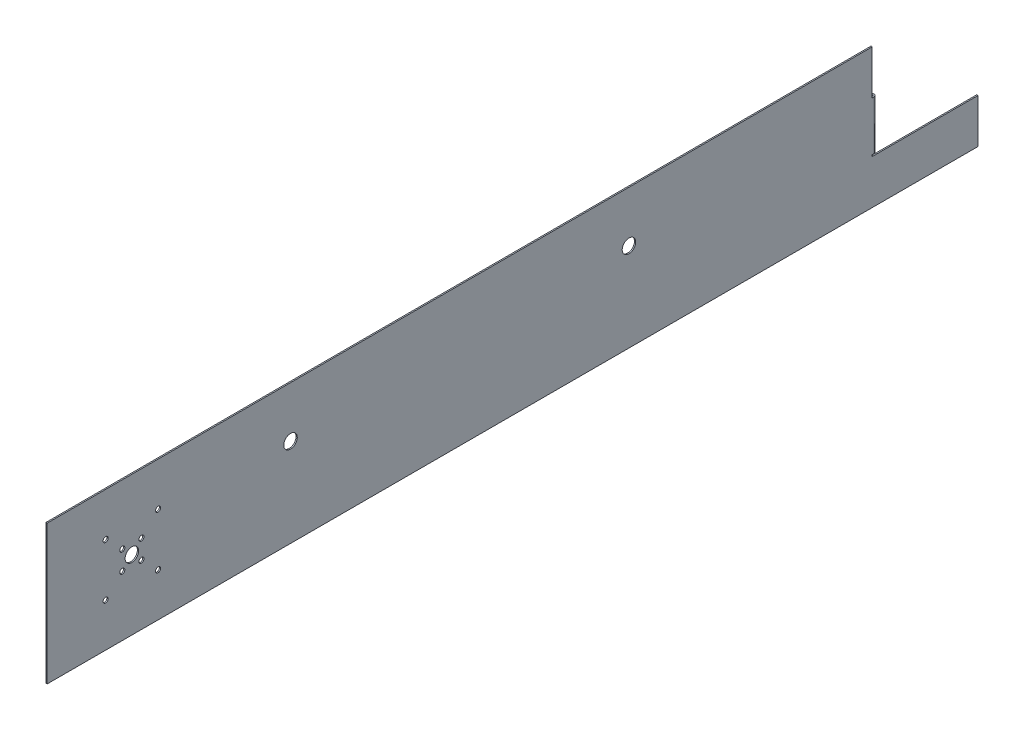
ISO-10303-21;
HEADER;
FILE_DESCRIPTION(('STEP AP214'),'2;1');
FILE_NAME('part.step','',(''),(''),'','','');
FILE_SCHEMA(('AUTOMOTIVE_DESIGN { 1 0 10303 214 1 1 1 1 }'));
ENDSEC;
DATA;
#1=APPLICATION_CONTEXT('core data for automotive mechanical design processes');
#2=APPLICATION_PROTOCOL_DEFINITION('international standard','automotive_design',2000,#1);
#3=PRODUCT_CONTEXT('',#1,'mechanical');
#4=PRODUCT('Part','Part','',(#3));
#5=PRODUCT_RELATED_PRODUCT_CATEGORY('part','',(#4));
#6=PRODUCT_DEFINITION_FORMATION('','',#4);
#7=PRODUCT_DEFINITION_CONTEXT('part definition',#1,'design');
#8=PRODUCT_DEFINITION('design','',#6,#7);
#9=PRODUCT_DEFINITION_SHAPE('','',#8);
#10=(LENGTH_UNIT() NAMED_UNIT(*) SI_UNIT(.MILLI.,.METRE.));
#11=(NAMED_UNIT(*) PLANE_ANGLE_UNIT() SI_UNIT($,.RADIAN.));
#12=(NAMED_UNIT(*) SI_UNIT($,.STERADIAN.) SOLID_ANGLE_UNIT());
#13=UNCERTAINTY_MEASURE_WITH_UNIT(LENGTH_MEASURE(1.E-05),#10,'distance_accuracy_value','');
#14=(GEOMETRIC_REPRESENTATION_CONTEXT(3) GLOBAL_UNCERTAINTY_ASSIGNED_CONTEXT((#13)) GLOBAL_UNIT_ASSIGNED_CONTEXT((#10,
#11,#12)) REPRESENTATION_CONTEXT('',''));
#15=CARTESIAN_POINT('',(0.,0.,0.));
#16=DIRECTION('',(0.,0.,1.));
#17=DIRECTION('',(1.,0.,0.));
#18=AXIS2_PLACEMENT_3D('',#15,#16,#17);
#19=CARTESIAN_POINT('',(60.486673162917,82.3,-60.0124460243925));
#20=DIRECTION('',(1.,0.,0.));
#21=DIRECTION('',(0.,0.,-1.));
#22=AXIS2_PLACEMENT_3D('',#19,#20,#21);
#23=PLANE('',#22);
#24=CARTESIAN_POINT('',(60.4866731629163,52.3,146.237553975608));
#25=DIRECTION('',(1.,0.,0.));
#26=DIRECTION('',(0.,0.,-1.));
#27=AXIS2_PLACEMENT_3D('',#24,#25,#26);
#28=CIRCLE('',#27,3.99999999999999);
#29=CARTESIAN_POINT('',(60.4866731629163,52.3,142.237553975608));
#30=VERTEX_POINT('',#29);
#31=EDGE_CURVE('E449',#30,#30,#28,.T.);
#32=ORIENTED_EDGE('',*,*,#31,.T.);
#33=EDGE_LOOP('',(#32));
#34=FACE_BOUND('',#33,.T.);
#35=CARTESIAN_POINT('',(60.4866731629156,52.3,346.237553975608));
#36=DIRECTION('',(1.,0.,0.));
#37=DIRECTION('',(0.,0.,-1.));
#38=AXIS2_PLACEMENT_3D('',#35,#36,#37);
#39=CIRCLE('',#38,3.99999999999999);
#40=CARTESIAN_POINT('',(60.4866731629156,52.3,342.237553975608));
#41=VERTEX_POINT('',#40);
#42=EDGE_CURVE('E440',#41,#41,#39,.T.);
#43=ORIENTED_EDGE('',*,*,#42,.T.);
#44=EDGE_LOOP('',(#43));
#45=FACE_BOUND('',#44,.T.);
#46=CARTESIAN_POINT('',(60.4866731629153,35.4931457505076,434.330699726115));
#47=DIRECTION('',(-1.,0.,0.));
#48=DIRECTION('',(0.,0.,1.));
#49=AXIS2_PLACEMENT_3D('',#46,#47,#48);
#50=CIRCLE('',#49,1.50000000000002);
#51=CARTESIAN_POINT('',(60.4866731629153,35.4931457505076,435.830699726115));
#52=VERTEX_POINT('',#51);
#53=EDGE_CURVE('E434',#52,#52,#50,.T.);
#54=ORIENTED_EDGE('',*,*,#53,.F.);
#55=EDGE_LOOP('',(#54));
#56=FACE_BOUND('',#55,.T.);
#57=CARTESIAN_POINT('',(60.4866731629153,35.4931457505076,445.6444082251));
#58=DIRECTION('',(-1.,0.,0.));
#59=DIRECTION('',(0.,0.,1.));
#60=AXIS2_PLACEMENT_3D('',#57,#58,#59);
#61=CIRCLE('',#60,1.50000000000002);
#62=CARTESIAN_POINT('',(60.4866731629153,35.4931457505076,447.1444082251));
#63=VERTEX_POINT('',#62);
#64=EDGE_CURVE('E428',#63,#63,#61,.T.);
#65=ORIENTED_EDGE('',*,*,#64,.F.);
#66=EDGE_LOOP('',(#65));
#67=FACE_BOUND('',#66,.T.);
#68=CARTESIAN_POINT('',(60.4866731629153,41.15,439.987553975607));
#69=DIRECTION('',(-1.,0.,0.));
#70=DIRECTION('',(0.,0.,1.));
#71=AXIS2_PLACEMENT_3D('',#68,#69,#70);
#72=CIRCLE('',#71,3.99999999999999);
#73=CARTESIAN_POINT('',(60.4866731629153,41.15,443.987553975607));
#74=VERTEX_POINT('',#73);
#75=EDGE_CURVE('E422',#74,#74,#72,.T.);
#76=ORIENTED_EDGE('',*,*,#75,.F.);
#77=EDGE_LOOP('',(#76));
#78=FACE_BOUND('',#77,.T.);
#79=CARTESIAN_POINT('',(60.4866731629153,46.8068542494924,434.330699726115));
#80=DIRECTION('',(-1.,0.,0.));
#81=DIRECTION('',(0.,0.,1.));
#82=AXIS2_PLACEMENT_3D('',#79,#80,#81);
#83=CIRCLE('',#82,1.50000000000002);
#84=CARTESIAN_POINT('',(60.4866731629153,46.8068542494924,435.830699726115));
#85=VERTEX_POINT('',#84);
#86=EDGE_CURVE('E417',#85,#85,#83,.T.);
#87=ORIENTED_EDGE('',*,*,#86,.F.);
#88=EDGE_LOOP('',(#87));
#89=FACE_BOUND('',#88,.T.);
#90=CARTESIAN_POINT('',(60.4866731629153,46.8068542494924,445.6444082251));
#91=DIRECTION('',(-1.,0.,0.));
#92=DIRECTION('',(0.,0.,1.));
#93=AXIS2_PLACEMENT_3D('',#90,#91,#92);
#94=CIRCLE('',#93,1.50000000000002);
#95=CARTESIAN_POINT('',(60.4866731629153,46.8068542494924,447.1444082251));
#96=VERTEX_POINT('',#95);
#97=EDGE_CURVE('E412',#96,#96,#94,.T.);
#98=ORIENTED_EDGE('',*,*,#97,.F.);
#99=EDGE_LOOP('',(#98));
#100=FACE_BOUND('',#99,.T.);
#101=CARTESIAN_POINT('',(60.4866731629152,56.65,455.487553975607));
#102=DIRECTION('',(-1.,0.,0.));
#103=DIRECTION('',(0.,0.,1.));
#104=AXIS2_PLACEMENT_3D('',#101,#102,#103);
#105=CIRCLE('',#104,1.50000000000008);
#106=CARTESIAN_POINT('',(60.4866731629152,56.65,456.987553975608));
#107=VERTEX_POINT('',#106);
#108=EDGE_CURVE('E320',#107,#107,#105,.T.);
#109=ORIENTED_EDGE('',*,*,#108,.F.);
#110=EDGE_LOOP('',(#109));
#111=FACE_BOUND('',#110,.T.);
#112=CARTESIAN_POINT('',(60.4866731629152,25.65,455.487553975607));
#113=DIRECTION('',(-1.,0.,0.));
#114=DIRECTION('',(0.,0.,1.));
#115=AXIS2_PLACEMENT_3D('',#112,#113,#114);
#116=CIRCLE('',#115,1.50000000000008);
#117=CARTESIAN_POINT('',(60.4866731629152,25.65,456.987553975608));
#118=VERTEX_POINT('',#117);
#119=EDGE_CURVE('E327',#118,#118,#116,.T.);
#120=ORIENTED_EDGE('',*,*,#119,.F.);
#121=EDGE_LOOP('',(#120));
#122=FACE_BOUND('',#121,.T.);
#123=CARTESIAN_POINT('',(60.4866731629153,25.65,424.487553975607));
#124=DIRECTION('',(-1.,0.,0.));
#125=DIRECTION('',(0.,0.,1.));
#126=AXIS2_PLACEMENT_3D('',#123,#124,#125);
#127=CIRCLE('',#126,1.50000000000008);
#128=CARTESIAN_POINT('',(60.4866731629153,25.65,425.987553975608));
#129=VERTEX_POINT('',#128);
#130=EDGE_CURVE('E331',#129,#129,#127,.T.);
#131=ORIENTED_EDGE('',*,*,#130,.F.);
#132=EDGE_LOOP('',(#131));
#133=FACE_BOUND('',#132,.T.);
#134=CARTESIAN_POINT('',(60.4866731629153,56.65,424.487553975607));
#135=DIRECTION('',(-1.,0.,0.));
#136=DIRECTION('',(0.,0.,1.));
#137=AXIS2_PLACEMENT_3D('',#134,#135,#136);
#138=CIRCLE('',#137,1.50000000000008);
#139=CARTESIAN_POINT('',(60.4866731629153,56.65,425.987553975608));
#140=VERTEX_POINT('',#139);
#141=EDGE_CURVE('E335',#140,#140,#138,.T.);
#142=ORIENTED_EDGE('',*,*,#141,.F.);
#143=EDGE_LOOP('',(#142));
#144=FACE_BOUND('',#143,.T.);
#145=DIRECTION('',(0.,0.,-1.));
#146=VECTOR('',#145,1.);
#147=CARTESIAN_POINT('',(60.486673162917,56.15,-60.0124460243925));
#148=LINE('',#147,#146);
#149=CARTESIAN_POINT('',(60.4866731629168,56.15,2.48755397560756));
#150=VERTEX_POINT('',#149);
#151=CARTESIAN_POINT('',(60.4866731629168,56.15,1.47320000000001));
#152=VERTEX_POINT('',#151);
#153=EDGE_CURVE('E144',#150,#152,#148,.T.);
#154=ORIENTED_EDGE('',*,*,#153,.T.);
#155=DIRECTION('',(0.,-1.,0.));
#156=VECTOR('',#155,1.);
#157=CARTESIAN_POINT('',(60.4866731629168,82.3,1.47320000000001));
#158=LINE('',#157,#156);
#159=CARTESIAN_POINT('',(60.4866731629168,27.15,1.47320000000001));
#160=VERTEX_POINT('',#159);
#161=EDGE_CURVE('E136',#152,#160,#158,.T.);
#162=ORIENTED_EDGE('',*,*,#161,.T.);
#163=DIRECTION('',(0.,0.,-1.));
#164=VECTOR('',#163,1.);
#165=CARTESIAN_POINT('',(60.486673162917,27.15,-60.0124460243925));
#166=LINE('',#165,#164);
#167=CARTESIAN_POINT('',(60.4866731629168,27.15,2.48755397560756));
#168=VERTEX_POINT('',#167);
#169=EDGE_CURVE('E152',#168,#160,#166,.T.);
#170=ORIENTED_EDGE('',*,*,#169,.F.);
#171=DIRECTION('',(0.,1.,0.));
#172=VECTOR('',#171,1.);
#173=CARTESIAN_POINT('',(60.4866731629168,0.,2.48755397560756));
#174=LINE('',#173,#172);
#175=CARTESIAN_POINT('',(60.4866731629168,26.15,2.48755397560756));
#176=VERTEX_POINT('',#175);
#177=EDGE_CURVE('E270',#176,#168,#174,.T.);
#178=ORIENTED_EDGE('',*,*,#177,.F.);
#179=DIRECTION('',(0.,0.,1.));
#180=VECTOR('',#179,1.);
#181=CARTESIAN_POINT('',(60.486673162917,26.15,-60.0124460243925));
#182=LINE('',#181,#180);
#183=CARTESIAN_POINT('',(60.486673162917,26.15,-60.0124460243925));
#184=VERTEX_POINT('',#183);
#185=EDGE_CURVE('E339',#184,#176,#182,.T.);
#186=ORIENTED_EDGE('',*,*,#185,.F.);
#187=DIRECTION('',(0.,-1.,0.));
#188=VECTOR('',#187,1.);
#189=CARTESIAN_POINT('',(60.486673162917,82.3,-60.0124460243925));
#190=LINE('',#189,#188);
#191=CARTESIAN_POINT('',(60.486673162917,0.,-60.0124460243925));
#192=VERTEX_POINT('',#191);
#193=EDGE_CURVE('E361',#184,#192,#190,.T.);
#194=ORIENTED_EDGE('',*,*,#193,.T.);
#195=DIRECTION('',(0.,0.,1.));
#196=VECTOR('',#195,1.);
#197=CARTESIAN_POINT('',(60.486673162917,0.,-60.0124460243925));
#198=LINE('',#197,#196);
#199=CARTESIAN_POINT('',(60.4866731629151,0.,489.987553975608));
#200=VERTEX_POINT('',#199);
#201=EDGE_CURVE('E352',#192,#200,#198,.T.);
#202=ORIENTED_EDGE('',*,*,#201,.T.);
#203=DIRECTION('',(0.,-1.,0.));
#204=VECTOR('',#203,1.);
#205=CARTESIAN_POINT('',(60.4866731629151,82.3,489.987553975608));
#206=LINE('',#205,#204);
#207=CARTESIAN_POINT('',(60.4866731629151,82.3,489.987553975608));
#208=VERTEX_POINT('',#207);
#209=EDGE_CURVE('E377',#208,#200,#206,.T.);
#210=ORIENTED_EDGE('',*,*,#209,.F.);
#211=DIRECTION('',(0.,0.,1.));
#212=VECTOR('',#211,1.);
#213=CARTESIAN_POINT('',(60.486673162917,82.3,-60.0124460243925));
#214=LINE('',#213,#212);
#215=CARTESIAN_POINT('',(60.4866731629168,82.3,2.48755397560756));
#216=VERTEX_POINT('',#215);
#217=EDGE_CURVE('E353',#216,#208,#214,.T.);
#218=ORIENTED_EDGE('',*,*,#217,.F.);
#219=DIRECTION('',(0.,-1.,0.));
#220=VECTOR('',#219,1.);
#221=CARTESIAN_POINT('',(60.4866731629168,0.,2.48755397560756));
#222=LINE('',#221,#220);
#223=EDGE_CURVE('E341',#216,#150,#222,.T.);
#224=ORIENTED_EDGE('',*,*,#223,.T.);
#225=EDGE_LOOP('',(#154,#162,#170,#178,#186,#194,#202,#210,#218,#224));
#226=FACE_BOUND('',#225,.T.);
#227=ADVANCED_FACE('F127',(#34,#45,#56,#67,#78,#89,#100,#111,#122,#133,#144,#226),#23,.F.);
#228=CARTESIAN_POINT('',(61.223273162917,82.3,-60.0124460243925));
#229=DIRECTION('',(1.,0.,0.));
#230=DIRECTION('',(0.,0.,-1.));
#231=AXIS2_PLACEMENT_3D('',#228,#229,#230);
#232=PLANE('',#231);
#233=CARTESIAN_POINT('',(61.2232731629163,52.3,146.237553975608));
#234=DIRECTION('',(1.,0.,0.));
#235=DIRECTION('',(0.,0.,-1.));
#236=AXIS2_PLACEMENT_3D('',#233,#234,#235);
#237=CIRCLE('',#236,3.99999999999999);
#238=CARTESIAN_POINT('',(61.2232731629163,52.3,142.237553975608));
#239=VERTEX_POINT('',#238);
#240=EDGE_CURVE('E446',#239,#239,#237,.T.);
#241=ORIENTED_EDGE('',*,*,#240,.F.);
#242=EDGE_LOOP('',(#241));
#243=FACE_BOUND('',#242,.T.);
#244=CARTESIAN_POINT('',(61.2232731629156,52.3,346.237553975608));
#245=DIRECTION('',(1.,0.,0.));
#246=DIRECTION('',(0.,0.,-1.));
#247=AXIS2_PLACEMENT_3D('',#244,#245,#246);
#248=CIRCLE('',#247,3.99999999999999);
#249=CARTESIAN_POINT('',(61.2232731629156,52.3,342.237553975608));
#250=VERTEX_POINT('',#249);
#251=EDGE_CURVE('E443',#250,#250,#248,.T.);
#252=ORIENTED_EDGE('',*,*,#251,.F.);
#253=EDGE_LOOP('',(#252));
#254=FACE_BOUND('',#253,.T.);
#255=CARTESIAN_POINT('',(61.2232731629153,35.4931457505076,434.330699726115));
#256=DIRECTION('',(-1.,0.,0.));
#257=DIRECTION('',(0.,0.,1.));
#258=AXIS2_PLACEMENT_3D('',#255,#256,#257);
#259=CIRCLE('',#258,1.50000000000002);
#260=CARTESIAN_POINT('',(61.2232731629153,35.4931457505076,435.830699726115));
#261=VERTEX_POINT('',#260);
#262=EDGE_CURVE('E437',#261,#261,#259,.T.);
#263=ORIENTED_EDGE('',*,*,#262,.T.);
#264=EDGE_LOOP('',(#263));
#265=FACE_BOUND('',#264,.T.);
#266=CARTESIAN_POINT('',(61.2232731629153,35.4931457505076,445.6444082251));
#267=DIRECTION('',(-1.,0.,0.));
#268=DIRECTION('',(0.,0.,1.));
#269=AXIS2_PLACEMENT_3D('',#266,#267,#268);
#270=CIRCLE('',#269,1.50000000000002);
#271=CARTESIAN_POINT('',(61.2232731629153,35.4931457505076,447.1444082251));
#272=VERTEX_POINT('',#271);
#273=EDGE_CURVE('E431',#272,#272,#270,.T.);
#274=ORIENTED_EDGE('',*,*,#273,.T.);
#275=EDGE_LOOP('',(#274));
#276=FACE_BOUND('',#275,.T.);
#277=CARTESIAN_POINT('',(61.2232731629153,41.15,439.987553975607));
#278=DIRECTION('',(-1.,0.,0.));
#279=DIRECTION('',(0.,0.,1.));
#280=AXIS2_PLACEMENT_3D('',#277,#278,#279);
#281=CIRCLE('',#280,3.99999999999999);
#282=CARTESIAN_POINT('',(61.2232731629153,41.15,443.987553975607));
#283=VERTEX_POINT('',#282);
#284=EDGE_CURVE('E425',#283,#283,#281,.T.);
#285=ORIENTED_EDGE('',*,*,#284,.T.);
#286=EDGE_LOOP('',(#285));
#287=FACE_BOUND('',#286,.T.);
#288=CARTESIAN_POINT('',(61.2232731629153,46.8068542494924,434.330699726115));
#289=DIRECTION('',(-1.,0.,0.));
#290=DIRECTION('',(0.,0.,1.));
#291=AXIS2_PLACEMENT_3D('',#288,#289,#290);
#292=CIRCLE('',#291,1.50000000000002);
#293=CARTESIAN_POINT('',(61.2232731629153,46.8068542494924,435.830699726115));
#294=VERTEX_POINT('',#293);
#295=EDGE_CURVE('E419',#294,#294,#292,.T.);
#296=ORIENTED_EDGE('',*,*,#295,.T.);
#297=EDGE_LOOP('',(#296));
#298=FACE_BOUND('',#297,.T.);
#299=CARTESIAN_POINT('',(61.2232731629153,46.8068542494924,445.6444082251));
#300=DIRECTION('',(-1.,0.,0.));
#301=DIRECTION('',(0.,0.,1.));
#302=AXIS2_PLACEMENT_3D('',#299,#300,#301);
#303=CIRCLE('',#302,1.50000000000002);
#304=CARTESIAN_POINT('',(61.2232731629153,46.8068542494924,447.1444082251));
#305=VERTEX_POINT('',#304);
#306=EDGE_CURVE('E410',#305,#305,#303,.T.);
#307=ORIENTED_EDGE('',*,*,#306,.T.);
#308=EDGE_LOOP('',(#307));
#309=FACE_BOUND('',#308,.T.);
#310=DIRECTION('',(0.,-1.,0.));
#311=VECTOR('',#310,1.);
#312=CARTESIAN_POINT('',(61.2232731629168,82.3,1.47320000000001));
#313=LINE('',#312,#311);
#314=CARTESIAN_POINT('',(61.2232731629168,56.15,1.47320000000001));
#315=VERTEX_POINT('',#314);
#316=CARTESIAN_POINT('',(61.2232731629168,27.15,1.47320000000001));
#317=VERTEX_POINT('',#316);
#318=EDGE_CURVE('E389',#315,#317,#313,.T.);
#319=ORIENTED_EDGE('',*,*,#318,.F.);
#320=DIRECTION('',(0.,0.,1.));
#321=VECTOR('',#320,1.);
#322=CARTESIAN_POINT('',(61.223273162917,56.15,-60.0124460243925));
#323=LINE('',#322,#321);
#324=CARTESIAN_POINT('',(61.2232731629168,56.15,2.48755397560756));
#325=VERTEX_POINT('',#324);
#326=EDGE_CURVE('E131',#315,#325,#323,.T.);
#327=ORIENTED_EDGE('',*,*,#326,.T.);
#328=DIRECTION('',(0.,1.,0.));
#329=VECTOR('',#328,1.);
#330=CARTESIAN_POINT('',(61.2232731629168,82.3,2.48755397560756));
#331=LINE('',#330,#329);
#332=CARTESIAN_POINT('',(61.2232731629168,82.3,2.48755397560756));
#333=VERTEX_POINT('',#332);
#334=EDGE_CURVE('E346',#325,#333,#331,.T.);
#335=ORIENTED_EDGE('',*,*,#334,.T.);
#336=DIRECTION('',(0.,0.,1.));
#337=VECTOR('',#336,1.);
#338=CARTESIAN_POINT('',(61.223273162917,82.3,-60.0124460243925));
#339=LINE('',#338,#337);
#340=CARTESIAN_POINT('',(61.2232731629151,82.3,489.987553975608));
#341=VERTEX_POINT('',#340);
#342=EDGE_CURVE('E359',#333,#341,#339,.T.);
#343=ORIENTED_EDGE('',*,*,#342,.T.);
#344=DIRECTION('',(0.,-1.,0.));
#345=VECTOR('',#344,1.);
#346=CARTESIAN_POINT('',(61.2232731629151,82.3,489.987553975608));
#347=LINE('',#346,#345);
#348=CARTESIAN_POINT('',(61.2232731629151,0.,489.987553975608));
#349=VERTEX_POINT('',#348);
#350=EDGE_CURVE('E375',#341,#349,#347,.T.);
#351=ORIENTED_EDGE('',*,*,#350,.T.);
#352=DIRECTION('',(0.,0.,1.));
#353=VECTOR('',#352,1.);
#354=CARTESIAN_POINT('',(61.223273162917,0.,-60.0124460243925));
#355=LINE('',#354,#353);
#356=CARTESIAN_POINT('',(61.223273162917,0.,-60.0124460243925));
#357=VERTEX_POINT('',#356);
#358=EDGE_CURVE('E367',#357,#349,#355,.T.);
#359=ORIENTED_EDGE('',*,*,#358,.F.);
#360=DIRECTION('',(0.,-1.,0.));
#361=VECTOR('',#360,1.);
#362=CARTESIAN_POINT('',(61.223273162917,82.3,-60.0124460243925));
#363=LINE('',#362,#361);
#364=CARTESIAN_POINT('',(61.223273162917,26.15,-60.0124460243925));
#365=VERTEX_POINT('',#364);
#366=EDGE_CURVE('E373',#365,#357,#363,.T.);
#367=ORIENTED_EDGE('',*,*,#366,.F.);
#368=DIRECTION('',(0.,0.,-1.));
#369=VECTOR('',#368,1.);
#370=CARTESIAN_POINT('',(61.223273162917,26.15,-60.0124460243925));
#371=LINE('',#370,#369);
#372=CARTESIAN_POINT('',(61.2232731629168,26.15,2.48755397560756));
#373=VERTEX_POINT('',#372);
#374=EDGE_CURVE('E350',#373,#365,#371,.T.);
#375=ORIENTED_EDGE('',*,*,#374,.F.);
#376=DIRECTION('',(0.,1.,0.));
#377=VECTOR('',#376,1.);
#378=CARTESIAN_POINT('',(61.2232731629168,82.3,2.48755397560756));
#379=LINE('',#378,#377);
#380=CARTESIAN_POINT('',(61.2232731629168,27.15,2.48755397560756));
#381=VERTEX_POINT('',#380);
#382=EDGE_CURVE('E312',#373,#381,#379,.T.);
#383=ORIENTED_EDGE('',*,*,#382,.T.);
#384=DIRECTION('',(0.,0.,-1.));
#385=VECTOR('',#384,1.);
#386=CARTESIAN_POINT('',(61.223273162917,27.15,-60.0124460243925));
#387=LINE('',#386,#385);
#388=EDGE_CURVE('E315',#381,#317,#387,.T.);
#389=ORIENTED_EDGE('',*,*,#388,.T.);
#390=EDGE_LOOP('',(#319,#327,#335,#343,#351,#359,#367,#375,#383,#389));
#391=FACE_BOUND('',#390,.T.);
#392=CARTESIAN_POINT('',(61.2232731629152,56.65,455.487553975607));
#393=DIRECTION('',(1.,0.,0.));
#394=DIRECTION('',(0.,0.,-1.));
#395=AXIS2_PLACEMENT_3D('',#392,#393,#394);
#396=CIRCLE('',#395,1.50000000000008);
#397=CARTESIAN_POINT('',(61.2232731629152,56.65,453.987553975607));
#398=VERTEX_POINT('',#397);
#399=EDGE_CURVE('E326',#398,#398,#396,.T.);
#400=ORIENTED_EDGE('',*,*,#399,.F.);
#401=EDGE_LOOP('',(#400));
#402=FACE_BOUND('',#401,.T.);
#403=CARTESIAN_POINT('',(61.2232731629152,25.65,455.487553975607));
#404=DIRECTION('',(1.,0.,0.));
#405=DIRECTION('',(0.,0.,-1.));
#406=AXIS2_PLACEMENT_3D('',#403,#404,#405);
#407=CIRCLE('',#406,1.50000000000008);
#408=CARTESIAN_POINT('',(61.2232731629152,25.65,453.987553975607));
#409=VERTEX_POINT('',#408);
#410=EDGE_CURVE('E330',#409,#409,#407,.T.);
#411=ORIENTED_EDGE('',*,*,#410,.F.);
#412=EDGE_LOOP('',(#411));
#413=FACE_BOUND('',#412,.T.);
#414=CARTESIAN_POINT('',(61.2232731629153,25.65,424.487553975607));
#415=DIRECTION('',(1.,0.,0.));
#416=DIRECTION('',(0.,0.,-1.));
#417=AXIS2_PLACEMENT_3D('',#414,#415,#416);
#418=CIRCLE('',#417,1.50000000000008);
#419=CARTESIAN_POINT('',(61.2232731629153,25.65,422.987553975607));
#420=VERTEX_POINT('',#419);
#421=EDGE_CURVE('E334',#420,#420,#418,.T.);
#422=ORIENTED_EDGE('',*,*,#421,.F.);
#423=EDGE_LOOP('',(#422));
#424=FACE_BOUND('',#423,.T.);
#425=CARTESIAN_POINT('',(61.2232731629153,56.65,424.487553975607));
#426=DIRECTION('',(1.,0.,0.));
#427=DIRECTION('',(0.,0.,-1.));
#428=AXIS2_PLACEMENT_3D('',#425,#426,#427);
#429=CIRCLE('',#428,1.50000000000008);
#430=CARTESIAN_POINT('',(61.2232731629153,56.65,422.987553975607));
#431=VERTEX_POINT('',#430);
#432=EDGE_CURVE('E338',#431,#431,#429,.T.);
#433=ORIENTED_EDGE('',*,*,#432,.F.);
#434=EDGE_LOOP('',(#433));
#435=FACE_BOUND('',#434,.T.);
#436=ADVANCED_FACE('F398',(#243,#254,#265,#276,#287,#298,#309,#391,#402,#413,#424,#435),#232,.T.);
#437=CARTESIAN_POINT('',(61.223273162917,82.3,-60.0124460243925));
#438=DIRECTION('',(0.,-1.,0.));
#439=DIRECTION('',(0.,0.,-1.));
#440=AXIS2_PLACEMENT_3D('',#437,#438,#439);
#441=PLANE('',#440);
#442=DIRECTION('',(1.,0.,0.));
#443=VECTOR('',#442,1.);
#444=CARTESIAN_POINT('',(61.2232731629168,82.3,2.48755397560756));
#445=LINE('',#444,#443);
#446=EDGE_CURVE('E379',#216,#333,#445,.T.);
#447=ORIENTED_EDGE('',*,*,#446,.F.);
#448=ORIENTED_EDGE('',*,*,#217,.T.);
#449=DIRECTION('',(-1.,0.,0.));
#450=VECTOR('',#449,1.);
#451=CARTESIAN_POINT('',(61.2232731629151,82.3,489.987553975608));
#452=LINE('',#451,#450);
#453=EDGE_CURVE('E355',#341,#208,#452,.T.);
#454=ORIENTED_EDGE('',*,*,#453,.F.);
#455=ORIENTED_EDGE('',*,*,#342,.F.);
#456=EDGE_LOOP('',(#447,#448,#454,#455));
#457=FACE_BOUND('',#456,.T.);
#458=ADVANCED_FACE('F459',(#457),#441,.F.);
#459=CARTESIAN_POINT('',(61.2232731629151,82.3,489.987553975608));
#460=DIRECTION('',(0.,0.,1.));
#461=DIRECTION('',(1.,0.,0.));
#462=AXIS2_PLACEMENT_3D('',#459,#460,#461);
#463=PLANE('',#462);
#464=DIRECTION('',(-1.,0.,0.));
#465=VECTOR('',#464,1.);
#466=CARTESIAN_POINT('',(61.2232731629151,0.,489.987553975608));
#467=LINE('',#466,#465);
#468=EDGE_CURVE('E364',#349,#200,#467,.T.);
#469=ORIENTED_EDGE('',*,*,#468,.F.);
#470=ORIENTED_EDGE('',*,*,#350,.F.);
#471=ORIENTED_EDGE('',*,*,#453,.T.);
#472=ORIENTED_EDGE('',*,*,#209,.T.);
#473=EDGE_LOOP('',(#469,#470,#471,#472));
#474=FACE_BOUND('',#473,.T.);
#475=ADVANCED_FACE('F518',(#474),#463,.T.);
#476=CARTESIAN_POINT('',(60.486673162917,82.3,-60.0124460243925));
#477=DIRECTION('',(0.,0.,-1.));
#478=DIRECTION('',(-1.,0.,0.));
#479=AXIS2_PLACEMENT_3D('',#476,#477,#478);
#480=PLANE('',#479);
#481=DIRECTION('',(-1.,0.,0.));
#482=VECTOR('',#481,1.);
#483=CARTESIAN_POINT('',(70.486673162917,26.15,-60.0124460243925));
#484=LINE('',#483,#482);
#485=EDGE_CURVE('E344',#365,#184,#484,.T.);
#486=ORIENTED_EDGE('',*,*,#485,.F.);
#487=ORIENTED_EDGE('',*,*,#366,.T.);
#488=DIRECTION('',(1.,0.,0.));
#489=VECTOR('',#488,1.);
#490=CARTESIAN_POINT('',(60.486673162917,0.,-60.0124460243925));
#491=LINE('',#490,#489);
#492=EDGE_CURVE('E356',#192,#357,#491,.T.);
#493=ORIENTED_EDGE('',*,*,#492,.F.);
#494=ORIENTED_EDGE('',*,*,#193,.F.);
#495=EDGE_LOOP('',(#486,#487,#493,#494));
#496=FACE_BOUND('',#495,.T.);
#497=ADVANCED_FACE('F522',(#496),#480,.T.);
#498=CARTESIAN_POINT('',(61.223273162917,0.,-60.0124460243925));
#499=DIRECTION('',(0.,-1.,0.));
#500=DIRECTION('',(0.,0.,-1.));
#501=AXIS2_PLACEMENT_3D('',#498,#499,#500);
#502=PLANE('',#501);
#503=ORIENTED_EDGE('',*,*,#201,.F.);
#504=ORIENTED_EDGE('',*,*,#492,.T.);
#505=ORIENTED_EDGE('',*,*,#358,.T.);
#506=ORIENTED_EDGE('',*,*,#468,.T.);
#507=EDGE_LOOP('',(#503,#504,#505,#506));
#508=FACE_BOUND('',#507,.T.);
#509=ADVANCED_FACE('F514',(#508),#502,.T.);
#510=CARTESIAN_POINT('',(70.486673162917,26.15,-60.0124460243925));
#511=DIRECTION('',(0.,-1.,0.));
#512=DIRECTION('',(0.,0.,1.));
#513=AXIS2_PLACEMENT_3D('',#510,#511,#512);
#514=PLANE('',#513);
#515=ORIENTED_EDGE('',*,*,#374,.T.);
#516=ORIENTED_EDGE('',*,*,#485,.T.);
#517=ORIENTED_EDGE('',*,*,#185,.T.);
#518=DIRECTION('',(-1.,0.,0.));
#519=VECTOR('',#518,1.);
#520=CARTESIAN_POINT('',(60.4866731629168,26.15,2.48755397560756));
#521=LINE('',#520,#519);
#522=EDGE_CURVE('E321',#176,#373,#521,.F.);
#523=ORIENTED_EDGE('',*,*,#522,.T.);
#524=EDGE_LOOP('',(#515,#516,#517,#523));
#525=FACE_BOUND('',#524,.T.);
#526=ADVANCED_FACE('F510',(#525),#514,.F.);
#527=CARTESIAN_POINT('',(70.4866731629168,0.,2.48755397560758));
#528=DIRECTION('',(0.,0.,-1.));
#529=DIRECTION('',(-1.,0.,0.));
#530=AXIS2_PLACEMENT_3D('',#527,#528,#529);
#531=PLANE('',#530);
#532=DIRECTION('',(-1.,0.,0.));
#533=VECTOR('',#532,1.);
#534=CARTESIAN_POINT('',(70.4866731629168,56.15,2.48755397560758));
#535=LINE('',#534,#533);
#536=EDGE_CURVE('E343',#325,#150,#535,.T.);
#537=ORIENTED_EDGE('',*,*,#536,.T.);
#538=ORIENTED_EDGE('',*,*,#223,.F.);
#539=ORIENTED_EDGE('',*,*,#446,.T.);
#540=ORIENTED_EDGE('',*,*,#334,.F.);
#541=EDGE_LOOP('',(#537,#538,#539,#540));
#542=FACE_BOUND('',#541,.T.);
#543=ADVANCED_FACE('F504',(#542),#531,.T.);
#544=CARTESIAN_POINT('',(70.486673162917,56.15,-60.0124460243925));
#545=DIRECTION('',(0.,1.,0.));
#546=DIRECTION('',(0.,0.,-1.));
#547=AXIS2_PLACEMENT_3D('',#544,#545,#546);
#548=PLANE('',#547);
#549=DIRECTION('',(1.,0.,0.));
#550=VECTOR('',#549,1.);
#551=CARTESIAN_POINT('',(70.4866731629168,56.15,1.47320000000004));
#552=LINE('',#551,#550);
#553=EDGE_CURVE('E12',#152,#315,#552,.T.);
#554=ORIENTED_EDGE('',*,*,#553,.F.);
#555=ORIENTED_EDGE('',*,*,#153,.F.);
#556=ORIENTED_EDGE('',*,*,#536,.F.);
#557=ORIENTED_EDGE('',*,*,#326,.F.);
#558=EDGE_LOOP('',(#554,#555,#556,#557));
#559=FACE_BOUND('',#558,.T.);
#560=ADVANCED_FACE('F129',(#559),#548,.T.);
#561=CARTESIAN_POINT('',(70.4866731629153,56.65,424.487553975608));
#562=DIRECTION('',(-1.,0.,0.));
#563=DIRECTION('',(0.,0.,1.));
#564=AXIS2_PLACEMENT_3D('',#561,#562,#563);
#565=CYLINDRICAL_SURFACE('',#564,1.50000000000008);
#566=ORIENTED_EDGE('',*,*,#432,.T.);
#567=EDGE_LOOP('',(#566));
#568=FACE_BOUND('',#567,.T.);
#569=ORIENTED_EDGE('',*,*,#141,.T.);
#570=EDGE_LOOP('',(#569));
#571=FACE_BOUND('',#570,.T.);
#572=ADVANCED_FACE('F492',(#568,#571),#565,.F.);
#573=CARTESIAN_POINT('',(70.4866731629153,25.65,424.487553975608));
#574=DIRECTION('',(-1.,0.,0.));
#575=DIRECTION('',(0.,0.,1.));
#576=AXIS2_PLACEMENT_3D('',#573,#574,#575);
#577=CYLINDRICAL_SURFACE('',#576,1.50000000000008);
#578=ORIENTED_EDGE('',*,*,#421,.T.);
#579=EDGE_LOOP('',(#578));
#580=FACE_BOUND('',#579,.T.);
#581=ORIENTED_EDGE('',*,*,#130,.T.);
#582=EDGE_LOOP('',(#581));
#583=FACE_BOUND('',#582,.T.);
#584=ADVANCED_FACE('F494',(#580,#583),#577,.F.);
#585=CARTESIAN_POINT('',(70.4866731629152,25.65,455.487553975607));
#586=DIRECTION('',(-1.,0.,0.));
#587=DIRECTION('',(0.,0.,1.));
#588=AXIS2_PLACEMENT_3D('',#585,#586,#587);
#589=CYLINDRICAL_SURFACE('',#588,1.50000000000008);
#590=ORIENTED_EDGE('',*,*,#410,.T.);
#591=EDGE_LOOP('',(#590));
#592=FACE_BOUND('',#591,.T.);
#593=ORIENTED_EDGE('',*,*,#119,.T.);
#594=EDGE_LOOP('',(#593));
#595=FACE_BOUND('',#594,.T.);
#596=ADVANCED_FACE('F501',(#592,#595),#589,.F.);
#597=CARTESIAN_POINT('',(70.4866731629152,56.65,455.487553975607));
#598=DIRECTION('',(-1.,0.,0.));
#599=DIRECTION('',(0.,0.,1.));
#600=AXIS2_PLACEMENT_3D('',#597,#598,#599);
#601=CYLINDRICAL_SURFACE('',#600,1.50000000000008);
#602=ORIENTED_EDGE('',*,*,#399,.T.);
#603=EDGE_LOOP('',(#602));
#604=FACE_BOUND('',#603,.T.);
#605=ORIENTED_EDGE('',*,*,#108,.T.);
#606=EDGE_LOOP('',(#605));
#607=FACE_BOUND('',#606,.T.);
#608=ADVANCED_FACE('F533',(#604,#607),#601,.F.);
#609=CARTESIAN_POINT('',(60.486673162917,27.15,-60.0124460243925));
#610=DIRECTION('',(0.,-1.,0.));
#611=DIRECTION('',(0.,0.,-1.));
#612=AXIS2_PLACEMENT_3D('',#609,#610,#611);
#613=PLANE('',#612);
#614=DIRECTION('',(-1.,0.,0.));
#615=VECTOR('',#614,1.);
#616=CARTESIAN_POINT('',(60.4866731629168,27.15,1.47320000000001));
#617=LINE('',#616,#615);
#618=EDGE_CURVE('E391',#317,#160,#617,.T.);
#619=ORIENTED_EDGE('',*,*,#618,.F.);
#620=ORIENTED_EDGE('',*,*,#388,.F.);
#621=DIRECTION('',(-1.,0.,0.));
#622=VECTOR('',#621,1.);
#623=CARTESIAN_POINT('',(60.4866731629168,27.15,2.48755397560756));
#624=LINE('',#623,#622);
#625=EDGE_CURVE('E317',#168,#381,#624,.F.);
#626=ORIENTED_EDGE('',*,*,#625,.F.);
#627=ORIENTED_EDGE('',*,*,#169,.T.);
#628=EDGE_LOOP('',(#619,#620,#626,#627));
#629=FACE_BOUND('',#628,.T.);
#630=ADVANCED_FACE('F530',(#629),#613,.T.);
#631=CARTESIAN_POINT('',(60.4866731629168,0.,2.48755397560756));
#632=DIRECTION('',(0.,0.,-1.));
#633=DIRECTION('',(0.,1.,0.));
#634=AXIS2_PLACEMENT_3D('',#631,#632,#633);
#635=PLANE('',#634);
#636=ORIENTED_EDGE('',*,*,#177,.T.);
#637=ORIENTED_EDGE('',*,*,#625,.T.);
#638=ORIENTED_EDGE('',*,*,#382,.F.);
#639=ORIENTED_EDGE('',*,*,#522,.F.);
#640=EDGE_LOOP('',(#636,#637,#638,#639));
#641=FACE_BOUND('',#640,.T.);
#642=ADVANCED_FACE('F532',(#641),#635,.T.);
#643=CARTESIAN_POINT('',(37.5,0.,-9.2634));
#644=DIRECTION('',(1.,0.,0.));
#645=DIRECTION('',(0.,0.,-1.));
#646=AXIS2_PLACEMENT_3D('',#643,#644,#645);
#647=PLANE('',#646);
#648=DIRECTION('',(0.,0.,1.));
#649=VECTOR('',#648,1.);
#650=CARTESIAN_POINT('',(37.5,27.15,0.7366));
#651=LINE('',#650,#649);
#652=CARTESIAN_POINT('',(37.5,27.15,0.7366));
#653=VERTEX_POINT('',#652);
#654=CARTESIAN_POINT('',(37.5,27.15,0.));
#655=VERTEX_POINT('',#654);
#656=EDGE_CURVE('E280',#653,#655,#651,.F.);
#657=ORIENTED_EDGE('',*,*,#656,.F.);
#658=DIRECTION('',(0.,1.,0.));
#659=VECTOR('',#658,1.);
#660=CARTESIAN_POINT('',(37.5,0.,0.7366));
#661=LINE('',#660,#659);
#662=CARTESIAN_POINT('',(37.5,56.15,0.7366));
#663=VERTEX_POINT('',#662);
#664=EDGE_CURVE('E307',#653,#663,#661,.T.);
#665=ORIENTED_EDGE('',*,*,#664,.T.);
#666=DIRECTION('',(0.,0.,1.));
#667=VECTOR('',#666,1.);
#668=CARTESIAN_POINT('',(37.5,56.15,-9.2634));
#669=LINE('',#668,#667);
#670=CARTESIAN_POINT('',(37.5,56.15,0.));
#671=VERTEX_POINT('',#670);
#672=EDGE_CURVE('E267',#671,#663,#669,.T.);
#673=ORIENTED_EDGE('',*,*,#672,.F.);
#674=DIRECTION('',(0.,-1.,0.));
#675=VECTOR('',#674,1.);
#676=CARTESIAN_POINT('',(37.5,82.3,0.));
#677=LINE('',#676,#675);
#678=EDGE_CURVE('E257',#671,#655,#677,.T.);
#679=ORIENTED_EDGE('',*,*,#678,.T.);
#680=EDGE_LOOP('',(#657,#665,#673,#679));
#681=FACE_BOUND('',#680,.T.);
#682=ADVANCED_FACE('F538',(#681),#647,.F.);
#683=CARTESIAN_POINT('',(56.25,50.65,-9.2634));
#684=DIRECTION('',(0.,0.,1.));
#685=DIRECTION('',(1.,0.,0.));
#686=AXIS2_PLACEMENT_3D('',#683,#684,#685);
#687=CYLINDRICAL_SURFACE('',#686,1.5);
#688=CARTESIAN_POINT('',(56.25,50.65,0.));
#689=DIRECTION('',(0.,0.,-1.));
#690=DIRECTION('',(-1.,0.,0.));
#691=AXIS2_PLACEMENT_3D('',#688,#689,#690);
#692=CIRCLE('',#691,1.5);
#693=CARTESIAN_POINT('',(54.75,50.65,0.));
#694=VERTEX_POINT('',#693);
#695=EDGE_CURVE('E303',#694,#694,#692,.T.);
#696=ORIENTED_EDGE('',*,*,#695,.T.);
#697=EDGE_LOOP('',(#696));
#698=FACE_BOUND('',#697,.T.);
#699=CARTESIAN_POINT('',(56.25,50.65,0.7366));
#700=DIRECTION('',(0.,0.,1.));
#701=DIRECTION('',(1.,0.,0.));
#702=AXIS2_PLACEMENT_3D('',#699,#700,#701);
#703=CIRCLE('',#702,1.5);
#704=CARTESIAN_POINT('',(57.75,50.65,0.7366));
#705=VERTEX_POINT('',#704);
#706=EDGE_CURVE('E300',#705,#705,#703,.T.);
#707=ORIENTED_EDGE('',*,*,#706,.T.);
#708=EDGE_LOOP('',(#707));
#709=FACE_BOUND('',#708,.T.);
#710=ADVANCED_FACE('F573',(#698,#709),#687,.F.);
#711=CARTESIAN_POINT('',(56.25,31.65,-9.2634));
#712=DIRECTION('',(0.,0.,1.));
#713=DIRECTION('',(1.,0.,0.));
#714=AXIS2_PLACEMENT_3D('',#711,#712,#713);
#715=CYLINDRICAL_SURFACE('',#714,1.5);
#716=CARTESIAN_POINT('',(56.25,31.65,0.));
#717=DIRECTION('',(0.,0.,-1.));
#718=DIRECTION('',(-1.,0.,0.));
#719=AXIS2_PLACEMENT_3D('',#716,#717,#718);
#720=CIRCLE('',#719,1.5);
#721=CARTESIAN_POINT('',(54.75,31.65,0.));
#722=VERTEX_POINT('',#721);
#723=EDGE_CURVE('E261',#722,#722,#720,.F.);
#724=ORIENTED_EDGE('',*,*,#723,.F.);
#725=EDGE_LOOP('',(#724));
#726=FACE_BOUND('',#725,.T.);
#727=CARTESIAN_POINT('',(56.25,31.65,0.7366));
#728=DIRECTION('',(0.,0.,1.));
#729=DIRECTION('',(1.,0.,0.));
#730=AXIS2_PLACEMENT_3D('',#727,#728,#729);
#731=CIRCLE('',#730,1.5);
#732=CARTESIAN_POINT('',(57.75,31.65,0.7366));
#733=VERTEX_POINT('',#732);
#734=EDGE_CURVE('E268',#733,#733,#731,.F.);
#735=ORIENTED_EDGE('',*,*,#734,.F.);
#736=EDGE_LOOP('',(#735));
#737=FACE_BOUND('',#736,.T.);
#738=ADVANCED_FACE('F569',(#726,#737),#715,.F.);
#739=CARTESIAN_POINT('',(43.75,31.65,-9.2634));
#740=DIRECTION('',(0.,0.,1.));
#741=DIRECTION('',(1.,0.,0.));
#742=AXIS2_PLACEMENT_3D('',#739,#740,#741);
#743=CYLINDRICAL_SURFACE('',#742,1.5);
#744=CARTESIAN_POINT('',(43.75,31.65,0.));
#745=DIRECTION('',(0.,0.,-1.));
#746=DIRECTION('',(-1.,0.,0.));
#747=AXIS2_PLACEMENT_3D('',#744,#745,#746);
#748=CIRCLE('',#747,1.5);
#749=CARTESIAN_POINT('',(42.25,31.65,0.));
#750=VERTEX_POINT('',#749);
#751=EDGE_CURVE('E297',#750,#750,#748,.T.);
#752=ORIENTED_EDGE('',*,*,#751,.T.);
#753=EDGE_LOOP('',(#752));
#754=FACE_BOUND('',#753,.T.);
#755=CARTESIAN_POINT('',(43.75,31.65,0.7366));
#756=DIRECTION('',(0.,0.,1.));
#757=DIRECTION('',(1.,0.,0.));
#758=AXIS2_PLACEMENT_3D('',#755,#756,#757);
#759=CIRCLE('',#758,1.5);
#760=CARTESIAN_POINT('',(45.25,31.65,0.7366));
#761=VERTEX_POINT('',#760);
#762=EDGE_CURVE('E294',#761,#761,#759,.T.);
#763=ORIENTED_EDGE('',*,*,#762,.T.);
#764=EDGE_LOOP('',(#763));
#765=FACE_BOUND('',#764,.T.);
#766=ADVANCED_FACE('F565',(#754,#765),#743,.F.);
#767=CARTESIAN_POINT('',(43.75,50.65,-9.2634));
#768=DIRECTION('',(0.,0.,1.));
#769=DIRECTION('',(1.,0.,0.));
#770=AXIS2_PLACEMENT_3D('',#767,#768,#769);
#771=CYLINDRICAL_SURFACE('',#770,1.5);
#772=CARTESIAN_POINT('',(43.75,50.65,0.));
#773=DIRECTION('',(0.,0.,-1.));
#774=DIRECTION('',(-1.,0.,0.));
#775=AXIS2_PLACEMENT_3D('',#772,#773,#774);
#776=CIRCLE('',#775,1.5);
#777=CARTESIAN_POINT('',(42.25,50.65,0.));
#778=VERTEX_POINT('',#777);
#779=EDGE_CURVE('E291',#778,#778,#776,.F.);
#780=ORIENTED_EDGE('',*,*,#779,.F.);
#781=EDGE_LOOP('',(#780));
#782=FACE_BOUND('',#781,.T.);
#783=CARTESIAN_POINT('',(43.75,50.65,0.7366));
#784=DIRECTION('',(0.,0.,1.));
#785=DIRECTION('',(1.,0.,0.));
#786=AXIS2_PLACEMENT_3D('',#783,#784,#785);
#787=CIRCLE('',#786,1.5);
#788=CARTESIAN_POINT('',(45.25,50.65,0.7366));
#789=VERTEX_POINT('',#788);
#790=EDGE_CURVE('E273',#789,#789,#787,.F.);
#791=ORIENTED_EDGE('',*,*,#790,.F.);
#792=EDGE_LOOP('',(#791));
#793=FACE_BOUND('',#792,.T.);
#794=ADVANCED_FACE('F561',(#782,#793),#771,.F.);
#795=CARTESIAN_POINT('',(0.,82.3,0.));
#796=DIRECTION('',(0.,0.,-1.));
#797=DIRECTION('',(-1.,0.,0.));
#798=AXIS2_PLACEMENT_3D('',#795,#796,#797);
#799=PLANE('',#798);
#800=ORIENTED_EDGE('',*,*,#779,.T.);
#801=EDGE_LOOP('',(#800));
#802=FACE_BOUND('',#801,.T.);
#803=ORIENTED_EDGE('',*,*,#751,.F.);
#804=EDGE_LOOP('',(#803));
#805=FACE_BOUND('',#804,.T.);
#806=ORIENTED_EDGE('',*,*,#723,.T.);
#807=EDGE_LOOP('',(#806));
#808=FACE_BOUND('',#807,.T.);
#809=ORIENTED_EDGE('',*,*,#695,.F.);
#810=EDGE_LOOP('',(#809));
#811=FACE_BOUND('',#810,.T.);
#812=DIRECTION('',(1.,0.,0.));
#813=VECTOR('',#812,1.);
#814=CARTESIAN_POINT('',(0.,56.15,0.));
#815=LINE('',#814,#813);
#816=CARTESIAN_POINT('',(59.7500731629168,56.15,0.));
#817=VERTEX_POINT('',#816);
#818=EDGE_CURVE('E252',#671,#817,#815,.T.);
#819=ORIENTED_EDGE('',*,*,#818,.T.);
#820=DIRECTION('',(0.,-1.,0.));
#821=VECTOR('',#820,1.);
#822=CARTESIAN_POINT('',(59.7500731629168,82.3,0.));
#823=LINE('',#822,#821);
#824=CARTESIAN_POINT('',(59.7500731629168,27.15,0.));
#825=VERTEX_POINT('',#824);
#826=EDGE_CURVE('E245',#817,#825,#823,.T.);
#827=ORIENTED_EDGE('',*,*,#826,.T.);
#828=DIRECTION('',(-1.,0.,0.));
#829=VECTOR('',#828,1.);
#830=CARTESIAN_POINT('',(0.,27.15,0.));
#831=LINE('',#830,#829);
#832=EDGE_CURVE('E251',#825,#655,#831,.T.);
#833=ORIENTED_EDGE('',*,*,#832,.T.);
#834=ORIENTED_EDGE('',*,*,#678,.F.);
#835=EDGE_LOOP('',(#819,#827,#833,#834));
#836=FACE_BOUND('',#835,.T.);
#837=ADVANCED_FACE('F255',(#802,#805,#808,#811,#836),#799,.T.);
#838=CARTESIAN_POINT('',(0.,27.15,0.7366));
#839=DIRECTION('',(0.,-1.,0.));
#840=DIRECTION('',(-1.,0.,0.));
#841=AXIS2_PLACEMENT_3D('',#838,#839,#840);
#842=PLANE('',#841);
#843=ORIENTED_EDGE('',*,*,#832,.F.);
#844=DIRECTION('',(0.,0.,1.));
#845=VECTOR('',#844,1.);
#846=CARTESIAN_POINT('',(59.7500731629168,27.15,0.7366));
#847=LINE('',#846,#845);
#848=CARTESIAN_POINT('',(59.7500731629168,27.15,0.7366));
#849=VERTEX_POINT('',#848);
#850=EDGE_CURVE('E285',#825,#849,#847,.T.);
#851=ORIENTED_EDGE('',*,*,#850,.T.);
#852=DIRECTION('',(-1.,0.,0.));
#853=VECTOR('',#852,1.);
#854=CARTESIAN_POINT('',(0.,27.15,0.7366));
#855=LINE('',#854,#853);
#856=EDGE_CURVE('E283',#849,#653,#855,.T.);
#857=ORIENTED_EDGE('',*,*,#856,.T.);
#858=ORIENTED_EDGE('',*,*,#656,.T.);
#859=EDGE_LOOP('',(#843,#851,#857,#858));
#860=FACE_BOUND('',#859,.T.);
#861=ADVANCED_FACE('F554',(#860),#842,.T.);
#862=CARTESIAN_POINT('',(0.,82.3,0.7366));
#863=DIRECTION('',(0.,0.,-1.));
#864=DIRECTION('',(-1.,0.,0.));
#865=AXIS2_PLACEMENT_3D('',#862,#863,#864);
#866=PLANE('',#865);
#867=DIRECTION('',(0.,-1.,0.));
#868=VECTOR('',#867,1.);
#869=CARTESIAN_POINT('',(59.7500731629168,82.3,0.7366));
#870=LINE('',#869,#868);
#871=CARTESIAN_POINT('',(59.7500731629168,56.15,0.7366));
#872=VERTEX_POINT('',#871);
#873=EDGE_CURVE('E310',#872,#849,#870,.T.);
#874=ORIENTED_EDGE('',*,*,#873,.F.);
#875=DIRECTION('',(-1.,0.,0.));
#876=VECTOR('',#875,1.);
#877=CARTESIAN_POINT('',(0.,56.15,0.7366));
#878=LINE('',#877,#876);
#879=EDGE_CURVE('E265',#872,#663,#878,.T.);
#880=ORIENTED_EDGE('',*,*,#879,.T.);
#881=ORIENTED_EDGE('',*,*,#664,.F.);
#882=ORIENTED_EDGE('',*,*,#856,.F.);
#883=EDGE_LOOP('',(#874,#880,#881,#882));
#884=FACE_BOUND('',#883,.T.);
#885=ORIENTED_EDGE('',*,*,#790,.T.);
#886=EDGE_LOOP('',(#885));
#887=FACE_BOUND('',#886,.T.);
#888=ORIENTED_EDGE('',*,*,#762,.F.);
#889=EDGE_LOOP('',(#888));
#890=FACE_BOUND('',#889,.T.);
#891=ORIENTED_EDGE('',*,*,#734,.T.);
#892=EDGE_LOOP('',(#891));
#893=FACE_BOUND('',#892,.T.);
#894=ORIENTED_EDGE('',*,*,#706,.F.);
#895=EDGE_LOOP('',(#894));
#896=FACE_BOUND('',#895,.T.);
#897=ADVANCED_FACE('F551',(#884,#887,#890,#893,#896),#866,.F.);
#898=CARTESIAN_POINT('',(0.,56.15,-9.2634));
#899=DIRECTION('',(0.,1.,0.));
#900=DIRECTION('',(-1.,0.,0.));
#901=AXIS2_PLACEMENT_3D('',#898,#899,#900);
#902=PLANE('',#901);
#903=ORIENTED_EDGE('',*,*,#879,.F.);
#904=DIRECTION('',(0.,0.,-1.));
#905=VECTOR('',#904,1.);
#906=CARTESIAN_POINT('',(59.7500731629168,56.15,-9.2634));
#907=LINE('',#906,#905);
#908=EDGE_CURVE('E236',#872,#817,#907,.T.);
#909=ORIENTED_EDGE('',*,*,#908,.T.);
#910=ORIENTED_EDGE('',*,*,#818,.F.);
#911=ORIENTED_EDGE('',*,*,#672,.T.);
#912=EDGE_LOOP('',(#903,#909,#910,#911));
#913=FACE_BOUND('',#912,.T.);
#914=ADVANCED_FACE('F264',(#913),#902,.T.);
#915=CARTESIAN_POINT('',(59.7500731629168,56.15,1.4732));
#916=DIRECTION('',(0.,1.,0.));
#917=DIRECTION('',(0.,0.,1.));
#918=AXIS2_PLACEMENT_3D('',#915,#916,#917);
#919=PLANE('',#918);
#920=ORIENTED_EDGE('',*,*,#908,.F.);
#921=CARTESIAN_POINT('',(59.7500731629168,56.15,1.4732));
#922=DIRECTION('',(0.,-1.,0.));
#923=DIRECTION('',(0.,0.,-1.));
#924=AXIS2_PLACEMENT_3D('',#921,#922,#923);
#925=CIRCLE('',#924,0.7366);
#926=EDGE_CURVE('E409',#872,#152,#925,.T.);
#927=ORIENTED_EDGE('',*,*,#926,.T.);
#928=ORIENTED_EDGE('',*,*,#553,.T.);
#929=CARTESIAN_POINT('',(59.7500731629168,56.15,1.4732));
#930=DIRECTION('',(0.,-1.,0.));
#931=DIRECTION('',(0.,0.,-1.));
#932=AXIS2_PLACEMENT_3D('',#929,#930,#931);
#933=CIRCLE('',#932,1.4732);
#934=EDGE_CURVE('E231',#817,#315,#933,.T.);
#935=ORIENTED_EDGE('',*,*,#934,.F.);
#936=EDGE_LOOP('',(#920,#927,#928,#935));
#937=FACE_BOUND('',#936,.T.);
#938=ADVANCED_FACE('F233',(#937),#919,.T.);
#939=CARTESIAN_POINT('',(59.7500731629168,27.15,1.4732));
#940=DIRECTION('',(0.,-1.,0.));
#941=DIRECTION('',(0.,0.,-1.));
#942=AXIS2_PLACEMENT_3D('',#939,#940,#941);
#943=PLANE('',#942);
#944=ORIENTED_EDGE('',*,*,#618,.T.);
#945=CARTESIAN_POINT('',(59.7500731629168,27.15,1.4732));
#946=DIRECTION('',(0.,-1.,0.));
#947=DIRECTION('',(0.,0.,-1.));
#948=AXIS2_PLACEMENT_3D('',#945,#946,#947);
#949=CIRCLE('',#948,0.7366);
#950=EDGE_CURVE('E241',#160,#849,#949,.F.);
#951=ORIENTED_EDGE('',*,*,#950,.T.);
#952=ORIENTED_EDGE('',*,*,#850,.F.);
#953=CARTESIAN_POINT('',(59.7500731629168,27.15,1.4732));
#954=DIRECTION('',(0.,1.,0.));
#955=DIRECTION('',(0.,0.,1.));
#956=AXIS2_PLACEMENT_3D('',#953,#954,#955);
#957=CIRCLE('',#956,1.4732);
#958=EDGE_CURVE('E240',#317,#825,#957,.T.);
#959=ORIENTED_EDGE('',*,*,#958,.F.);
#960=EDGE_LOOP('',(#944,#951,#952,#959));
#961=FACE_BOUND('',#960,.T.);
#962=ADVANCED_FACE('F403',(#961),#943,.T.);
#963=CARTESIAN_POINT('',(59.7500731629168,70.7112249005009,1.4732));
#964=DIRECTION('',(0.,-1.,0.));
#965=DIRECTION('',(0.,0.,-1.));
#966=AXIS2_PLACEMENT_3D('',#963,#964,#965);
#967=CYLINDRICAL_SURFACE('',#966,1.4732);
#968=ORIENTED_EDGE('',*,*,#958,.T.);
#969=ORIENTED_EDGE('',*,*,#826,.F.);
#970=ORIENTED_EDGE('',*,*,#934,.T.);
#971=ORIENTED_EDGE('',*,*,#318,.T.);
#972=EDGE_LOOP('',(#968,#969,#970,#971));
#973=FACE_BOUND('',#972,.T.);
#974=ADVANCED_FACE('F247',(#973),#967,.T.);
#975=CARTESIAN_POINT('',(59.7500731629168,70.7112249005009,1.4732));
#976=DIRECTION('',(0.,-1.,0.));
#977=DIRECTION('',(0.,0.,-1.));
#978=AXIS2_PLACEMENT_3D('',#975,#976,#977);
#979=CYLINDRICAL_SURFACE('',#978,0.7366);
#980=ORIENTED_EDGE('',*,*,#950,.F.);
#981=ORIENTED_EDGE('',*,*,#161,.F.);
#982=ORIENTED_EDGE('',*,*,#926,.F.);
#983=ORIENTED_EDGE('',*,*,#873,.T.);
#984=EDGE_LOOP('',(#980,#981,#982,#983));
#985=FACE_BOUND('',#984,.T.);
#986=ADVANCED_FACE('F585',(#985),#979,.F.);
#987=CARTESIAN_POINT('',(61.2232731629153,46.8068542494924,445.6444082251));
#988=DIRECTION('',(-1.,0.,0.));
#989=DIRECTION('',(0.,0.,1.));
#990=AXIS2_PLACEMENT_3D('',#987,#988,#989);
#991=CYLINDRICAL_SURFACE('',#990,1.50000000000002);
#992=ORIENTED_EDGE('',*,*,#306,.F.);
#993=EDGE_LOOP('',(#992));
#994=FACE_BOUND('',#993,.T.);
#995=ORIENTED_EDGE('',*,*,#97,.T.);
#996=EDGE_LOOP('',(#995));
#997=FACE_BOUND('',#996,.T.);
#998=ADVANCED_FACE('F475',(#994,#997),#991,.F.);
#999=CARTESIAN_POINT('',(61.2232731629153,46.8068542494924,434.330699726115));
#1000=DIRECTION('',(-1.,0.,0.));
#1001=DIRECTION('',(0.,0.,1.));
#1002=AXIS2_PLACEMENT_3D('',#999,#1000,#1001);
#1003=CYLINDRICAL_SURFACE('',#1002,1.50000000000002);
#1004=ORIENTED_EDGE('',*,*,#295,.F.);
#1005=EDGE_LOOP('',(#1004));
#1006=FACE_BOUND('',#1005,.T.);
#1007=ORIENTED_EDGE('',*,*,#86,.T.);
#1008=EDGE_LOOP('',(#1007));
#1009=FACE_BOUND('',#1008,.T.);
#1010=ADVANCED_FACE('F471',(#1006,#1009),#1003,.F.);
#1011=CARTESIAN_POINT('',(61.2232731629153,41.15,439.987553975607));
#1012=DIRECTION('',(-1.,0.,0.));
#1013=DIRECTION('',(0.,0.,1.));
#1014=AXIS2_PLACEMENT_3D('',#1011,#1012,#1013);
#1015=CYLINDRICAL_SURFACE('',#1014,3.99999999999999);
#1016=ORIENTED_EDGE('',*,*,#284,.F.);
#1017=EDGE_LOOP('',(#1016));
#1018=FACE_BOUND('',#1017,.T.);
#1019=ORIENTED_EDGE('',*,*,#75,.T.);
#1020=EDGE_LOOP('',(#1019));
#1021=FACE_BOUND('',#1020,.T.);
#1022=ADVANCED_FACE('F474',(#1018,#1021),#1015,.F.);
#1023=CARTESIAN_POINT('',(61.2232731629153,35.4931457505076,445.6444082251));
#1024=DIRECTION('',(-1.,0.,0.));
#1025=DIRECTION('',(0.,0.,1.));
#1026=AXIS2_PLACEMENT_3D('',#1023,#1024,#1025);
#1027=CYLINDRICAL_SURFACE('',#1026,1.50000000000002);
#1028=ORIENTED_EDGE('',*,*,#273,.F.);
#1029=EDGE_LOOP('',(#1028));
#1030=FACE_BOUND('',#1029,.T.);
#1031=ORIENTED_EDGE('',*,*,#64,.T.);
#1032=EDGE_LOOP('',(#1031));
#1033=FACE_BOUND('',#1032,.T.);
#1034=ADVANCED_FACE('F596',(#1030,#1033),#1027,.F.);
#1035=CARTESIAN_POINT('',(61.2232731629153,35.4931457505076,434.330699726115));
#1036=DIRECTION('',(-1.,0.,0.));
#1037=DIRECTION('',(0.,0.,1.));
#1038=AXIS2_PLACEMENT_3D('',#1035,#1036,#1037);
#1039=CYLINDRICAL_SURFACE('',#1038,1.50000000000002);
#1040=ORIENTED_EDGE('',*,*,#262,.F.);
#1041=EDGE_LOOP('',(#1040));
#1042=FACE_BOUND('',#1041,.T.);
#1043=ORIENTED_EDGE('',*,*,#53,.T.);
#1044=EDGE_LOOP('',(#1043));
#1045=FACE_BOUND('',#1044,.T.);
#1046=ADVANCED_FACE('F600',(#1042,#1045),#1039,.F.);
#1047=CARTESIAN_POINT('',(60.4866731629156,52.3,346.237553975608));
#1048=DIRECTION('',(1.,0.,0.));
#1049=DIRECTION('',(0.,0.,-1.));
#1050=AXIS2_PLACEMENT_3D('',#1047,#1048,#1049);
#1051=CYLINDRICAL_SURFACE('',#1050,3.99999999999999);
#1052=ORIENTED_EDGE('',*,*,#42,.F.);
#1053=EDGE_LOOP('',(#1052));
#1054=FACE_BOUND('',#1053,.T.);
#1055=ORIENTED_EDGE('',*,*,#251,.T.);
#1056=EDGE_LOOP('',(#1055));
#1057=FACE_BOUND('',#1056,.T.);
#1058=ADVANCED_FACE('F604',(#1054,#1057),#1051,.F.);
#1059=CARTESIAN_POINT('',(60.4866731629163,52.3,146.237553975608));
#1060=DIRECTION('',(1.,0.,0.));
#1061=DIRECTION('',(0.,0.,-1.));
#1062=AXIS2_PLACEMENT_3D('',#1059,#1060,#1061);
#1063=CYLINDRICAL_SURFACE('',#1062,3.99999999999999);
#1064=ORIENTED_EDGE('',*,*,#31,.F.);
#1065=EDGE_LOOP('',(#1064));
#1066=FACE_BOUND('',#1065,.T.);
#1067=ORIENTED_EDGE('',*,*,#240,.T.);
#1068=EDGE_LOOP('',(#1067));
#1069=FACE_BOUND('',#1068,.T.);
#1070=ADVANCED_FACE('F455',(#1066,#1069),#1063,.F.);
#1071=CLOSED_SHELL('',(#227,#436,#458,#475,#497,#509,#526,#543,#560,#572,#584,#596,#608,#630,
#642,#682,#710,#738,#766,#794,#837,#861,#897,#914,#938,#962,#974,#986,#998,#1010,#1022,#1034,
#1046,#1058,#1070));
#1072=MANIFOLD_SOLID_BREP('B2',#1071);
#1073=ADVANCED_BREP_SHAPE_REPRESENTATION('',(#18,#1072),#14);
#1074=SHAPE_DEFINITION_REPRESENTATION(#9,#1073);
ENDSEC;
END-ISO-10303-21;
